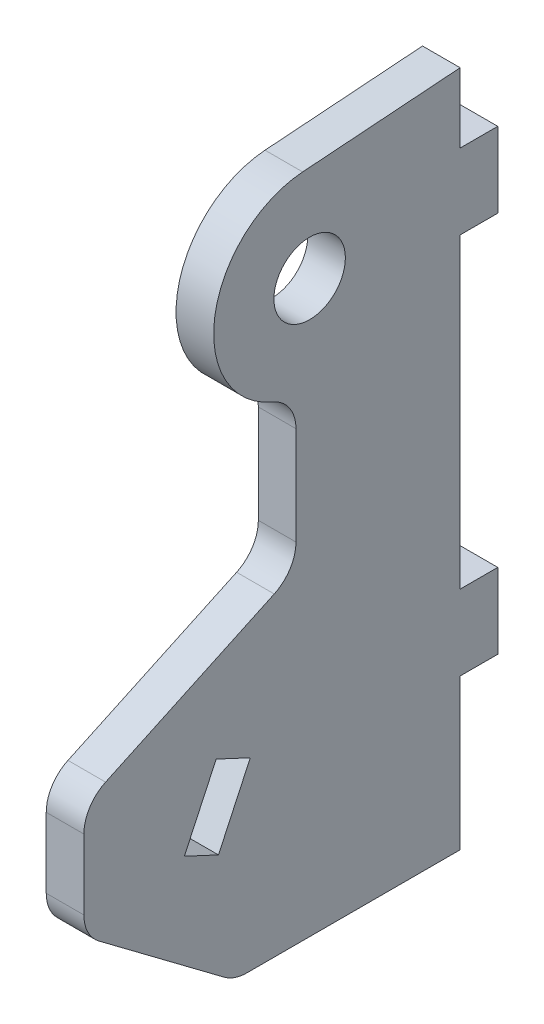
ISO-10303-21;
HEADER;
FILE_DESCRIPTION(('STEP AP214'),'2;1');
FILE_NAME('part.step','',(''),(''),'','','');
FILE_SCHEMA(('AUTOMOTIVE_DESIGN { 1 0 10303 214 1 1 1 1 }'));
ENDSEC;
DATA;
#1=APPLICATION_CONTEXT('core data for automotive mechanical design processes');
#2=APPLICATION_PROTOCOL_DEFINITION('international standard','automotive_design',2000,#1);
#3=PRODUCT_CONTEXT('',#1,'mechanical');
#4=PRODUCT('Part','Part','',(#3));
#5=PRODUCT_RELATED_PRODUCT_CATEGORY('part','',(#4));
#6=PRODUCT_DEFINITION_FORMATION('','',#4);
#7=PRODUCT_DEFINITION_CONTEXT('part definition',#1,'design');
#8=PRODUCT_DEFINITION('design','',#6,#7);
#9=PRODUCT_DEFINITION_SHAPE('','',#8);
#10=(LENGTH_UNIT() NAMED_UNIT(*) SI_UNIT(.MILLI.,.METRE.));
#11=(NAMED_UNIT(*) PLANE_ANGLE_UNIT() SI_UNIT($,.RADIAN.));
#12=(NAMED_UNIT(*) SI_UNIT($,.STERADIAN.) SOLID_ANGLE_UNIT());
#13=UNCERTAINTY_MEASURE_WITH_UNIT(LENGTH_MEASURE(1.E-05),#10,'distance_accuracy_value','');
#14=(GEOMETRIC_REPRESENTATION_CONTEXT(3) GLOBAL_UNCERTAINTY_ASSIGNED_CONTEXT((#13)) GLOBAL_UNIT_ASSIGNED_CONTEXT((#10,
#11,#12)) REPRESENTATION_CONTEXT('',''));
#15=CARTESIAN_POINT('',(0.,0.,0.));
#16=DIRECTION('',(0.,0.,1.));
#17=DIRECTION('',(1.,0.,0.));
#18=AXIS2_PLACEMENT_3D('',#15,#16,#17);
#19=CARTESIAN_POINT('',(2.5,-15.7577175116872,0.));
#20=DIRECTION('',(0.,0.,1.));
#21=DIRECTION('',(1.,0.,0.));
#22=AXIS2_PLACEMENT_3D('',#19,#20,#21);
#23=PLANE('',#22);
#24=DIRECTION('',(-1.,0.,0.));
#25=VECTOR('',#24,1.);
#26=CARTESIAN_POINT('',(0.,-55.7577175116872,0.));
#27=LINE('',#26,#25);
#28=CARTESIAN_POINT('',(2.5,-55.7577175116872,0.));
#29=VERTEX_POINT('',#28);
#30=CARTESIAN_POINT('',(-2.5,-55.7577175116872,0.));
#31=VERTEX_POINT('',#30);
#32=EDGE_CURVE('E64',#29,#31,#27,.T.);
#33=ORIENTED_EDGE('',*,*,#32,.F.);
#34=DIRECTION('',(0.,1.,0.));
#35=VECTOR('',#34,1.);
#36=CARTESIAN_POINT('',(2.5,-75.7577175116872,0.));
#37=LINE('',#36,#35);
#38=CARTESIAN_POINT('',(2.5,-75.7577175116872,0.));
#39=VERTEX_POINT('',#38);
#40=EDGE_CURVE('E306',#39,#29,#37,.T.);
#41=ORIENTED_EDGE('',*,*,#40,.F.);
#42=DIRECTION('',(-1.,0.,0.));
#43=VECTOR('',#42,1.);
#44=CARTESIAN_POINT('',(2.5,-75.7577175116872,0.));
#45=LINE('',#44,#43);
#46=CARTESIAN_POINT('',(-2.5,-75.7577175116872,0.));
#47=VERTEX_POINT('',#46);
#48=EDGE_CURVE('E355',#39,#47,#45,.T.);
#49=ORIENTED_EDGE('',*,*,#48,.T.);
#50=DIRECTION('',(0.,1.,0.));
#51=VECTOR('',#50,1.);
#52=CARTESIAN_POINT('',(-2.5,-15.7577175116872,0.));
#53=LINE('',#52,#51);
#54=EDGE_CURVE('E337',#47,#31,#53,.T.);
#55=ORIENTED_EDGE('',*,*,#54,.T.);
#56=EDGE_LOOP('',(#33,#41,#49,#55));
#57=FACE_BOUND('',#56,.T.);
#58=ADVANCED_FACE('F41',(#57),#23,.F.);
#59=CARTESIAN_POINT('',(2.5,0.,20.));
#60=DIRECTION('',(1.,0.,0.));
#61=DIRECTION('',(0.,0.,-1.));
#62=AXIS2_PLACEMENT_3D('',#59,#60,#61);
#63=PLANE('',#62);
#64=DIRECTION('',(0.,0.4226182617407,0.90630778703665));
#65=VECTOR('',#64,1.);
#66=CARTESIAN_POINT('',(2.5,-51.2261785765039,27.8869086912965));
#67=LINE('',#66,#65);
#68=CARTESIAN_POINT('',(2.5,-51.2261785765039,27.8869086912965));
#69=VERTEX_POINT('',#68);
#70=CARTESIAN_POINT('',(2.5,-49.1130872678004,32.4184476264797));
#71=VERTEX_POINT('',#70);
#72=EDGE_CURVE('E254',#69,#71,#67,.T.);
#73=ORIENTED_EDGE('',*,*,#72,.F.);
#74=DIRECTION('',(0.,-0.90630778703665,0.4226182617407));
#75=VECTOR('',#74,1.);
#76=CARTESIAN_POINT('',(2.5,-51.2261785765039,27.8869086912965));
#77=LINE('',#76,#75);
#78=CARTESIAN_POINT('',(2.5,-60.2892564468704,32.1130913087035));
#79=VERTEX_POINT('',#78);
#80=EDGE_CURVE('E262',#69,#79,#77,.T.);
#81=ORIENTED_EDGE('',*,*,#80,.T.);
#82=DIRECTION('',(0.,0.422618261740699,0.90630778703665));
#83=VECTOR('',#82,1.);
#84=CARTESIAN_POINT('',(2.5,-60.2892564468704,32.1130913087035));
#85=LINE('',#84,#83);
#86=CARTESIAN_POINT('',(2.5,-58.1761651381669,36.6446302438868));
#87=VERTEX_POINT('',#86);
#88=EDGE_CURVE('E259',#79,#87,#85,.T.);
#89=ORIENTED_EDGE('',*,*,#88,.T.);
#90=DIRECTION('',(0.,-0.90630778703665,0.422618261740701));
#91=VECTOR('',#90,1.);
#92=CARTESIAN_POINT('',(2.5,-49.1130872678004,32.4184476264797));
#93=LINE('',#92,#91);
#94=EDGE_CURVE('E256',#71,#87,#93,.T.);
#95=ORIENTED_EDGE('',*,*,#94,.F.);
#96=EDGE_LOOP('',(#73,#81,#89,#95));
#97=FACE_BOUND('',#96,.T.);
#98=DIRECTION('',(0.,-0.6,-0.8));
#99=VECTOR('',#98,1.);
#100=CARTESIAN_POINT('',(2.5,-75.7577175116872,30.));
#101=LINE('',#100,#99);
#102=CARTESIAN_POINT('',(2.5,-62.2577175116872,48.));
#103=VERTEX_POINT('',#102);
#104=CARTESIAN_POINT('',(2.5,-74.7577175116872,31.3333333333333));
#105=VERTEX_POINT('',#104);
#106=EDGE_CURVE('E302',#103,#105,#101,.T.);
#107=ORIENTED_EDGE('',*,*,#106,.T.);
#108=CARTESIAN_POINT('',(2.5,-70.7577175116872,28.3333333333333));
#109=DIRECTION('',(1.,0.,0.));
#110=DIRECTION('',(0.,0.,-1.));
#111=AXIS2_PLACEMENT_3D('',#108,#109,#110);
#112=CIRCLE('',#111,5.);
#113=CARTESIAN_POINT('',(2.5,-75.7577175116872,28.3333333333333));
#114=VERTEX_POINT('',#113);
#115=EDGE_CURVE('E394',#105,#114,#112,.T.);
#116=ORIENTED_EDGE('',*,*,#115,.T.);
#117=DIRECTION('',(0.,0.,-1.));
#118=VECTOR('',#117,1.);
#119=CARTESIAN_POINT('',(2.5,-75.7577175116872,30.));
#120=LINE('',#119,#118);
#121=EDGE_CURVE('E304',#114,#39,#120,.T.);
#122=ORIENTED_EDGE('',*,*,#121,.T.);
#123=ORIENTED_EDGE('',*,*,#40,.T.);
#124=DIRECTION('',(0.,0.,1.));
#125=VECTOR('',#124,1.);
#126=CARTESIAN_POINT('',(2.5,-55.7577175116872,-5.));
#127=LINE('',#126,#125);
#128=CARTESIAN_POINT('',(2.5,-55.7577175116872,-5.));
#129=VERTEX_POINT('',#128);
#130=EDGE_CURVE('E218',#129,#29,#127,.T.);
#131=ORIENTED_EDGE('',*,*,#130,.F.);
#132=DIRECTION('',(0.,-1.,0.));
#133=VECTOR('',#132,1.);
#134=CARTESIAN_POINT('',(2.5,0.,-5.));
#135=LINE('',#134,#133);
#136=CARTESIAN_POINT('',(2.5,-45.7577175116872,-5.));
#137=VERTEX_POINT('',#136);
#138=EDGE_CURVE('E221',#137,#129,#135,.T.);
#139=ORIENTED_EDGE('',*,*,#138,.F.);
#140=DIRECTION('',(0.,0.,1.));
#141=VECTOR('',#140,1.);
#142=CARTESIAN_POINT('',(2.5,-45.7577175116872,-5.));
#143=LINE('',#142,#141);
#144=CARTESIAN_POINT('',(2.5,-45.7577175116872,0.));
#145=VERTEX_POINT('',#144);
#146=EDGE_CURVE('E209',#137,#145,#143,.T.);
#147=ORIENTED_EDGE('',*,*,#146,.T.);
#148=CARTESIAN_POINT('',(2.5,-5.,0.));
#149=VERTEX_POINT('',#148);
#150=EDGE_CURVE('E56',#145,#149,#37,.T.);
#151=ORIENTED_EDGE('',*,*,#150,.T.);
#152=DIRECTION('',(0.,0.,-1.));
#153=VECTOR('',#152,1.);
#154=CARTESIAN_POINT('',(2.5,-5.,-5.));
#155=LINE('',#154,#153);
#156=CARTESIAN_POINT('',(2.5,-5.,-5.));
#157=VERTEX_POINT('',#156);
#158=EDGE_CURVE('E308',#149,#157,#155,.T.);
#159=ORIENTED_EDGE('',*,*,#158,.T.);
#160=DIRECTION('',(0.,1.,0.));
#161=VECTOR('',#160,1.);
#162=CARTESIAN_POINT('',(2.5,5.,-5.));
#163=LINE('',#162,#161);
#164=CARTESIAN_POINT('',(2.5,5.,-5.));
#165=VERTEX_POINT('',#164);
#166=EDGE_CURVE('E310',#157,#165,#163,.T.);
#167=ORIENTED_EDGE('',*,*,#166,.T.);
#168=DIRECTION('',(0.,0.,1.));
#169=VECTOR('',#168,1.);
#170=CARTESIAN_POINT('',(2.5,5.,-5.));
#171=LINE('',#170,#169);
#172=CARTESIAN_POINT('',(2.5,5.,0.));
#173=VERTEX_POINT('',#172);
#174=EDGE_CURVE('E312',#165,#173,#171,.T.);
#175=ORIENTED_EDGE('',*,*,#174,.T.);
#176=DIRECTION('',(0.,1.,0.));
#177=VECTOR('',#176,1.);
#178=CARTESIAN_POINT('',(2.5,5.,0.));
#179=LINE('',#178,#177);
#180=CARTESIAN_POINT('',(2.5,14.2422824883128,0.));
#181=VERTEX_POINT('',#180);
#182=EDGE_CURVE('E284',#173,#181,#179,.T.);
#183=ORIENTED_EDGE('',*,*,#182,.T.);
#184=DIRECTION('',(0.,-0.0727282972971378,0.997351790880359));
#185=VECTOR('',#184,1.);
#186=CARTESIAN_POINT('',(2.5,14.2422824883128,0.));
#187=LINE('',#186,#185);
#188=CARTESIAN_POINT('',(2.5,12.7162353337246,20.9272857905385));
#189=VERTEX_POINT('',#188);
#190=EDGE_CURVE('E287',#181,#189,#187,.T.);
#191=ORIENTED_EDGE('',*,*,#190,.T.);
#192=CARTESIAN_POINT('',(2.5,0.,20.));
#193=DIRECTION('',(1.,0.,0.));
#194=DIRECTION('',(0.,0.,-1.));
#195=AXIS2_PLACEMENT_3D('',#192,#193,#194);
#196=CIRCLE('',#195,12.75);
#197=CARTESIAN_POINT('',(2.5,-11.7727645964355,24.8953563462647));
#198=VERTEX_POINT('',#197);
#199=EDGE_CURVE('E290',#189,#198,#196,.T.);
#200=ORIENTED_EDGE('',*,*,#199,.T.);
#201=CARTESIAN_POINT('',(2.5,-16.3895350264103,26.8151039330352));
#202=DIRECTION('',(1.,0.,0.));
#203=DIRECTION('',(0.,0.,-1.));
#204=AXIS2_PLACEMENT_3D('',#201,#202,#203);
#205=CIRCLE('',#204,5.);
#206=CARTESIAN_POINT('',(2.5,-16.3895350264103,21.8151039330352));
#207=VERTEX_POINT('',#206);
#208=EDGE_CURVE('E403',#198,#207,#205,.F.);
#209=ORIENTED_EDGE('',*,*,#208,.T.);
#210=DIRECTION('',(0.,-1.,0.));
#211=VECTOR('',#210,1.);
#212=CARTESIAN_POINT('',(2.5,-32.6201385773802,21.8151039330352));
#213=LINE('',#212,#211);
#214=CARTESIAN_POINT('',(2.5,-29.4342490600651,21.8151039330352));
#215=VERTEX_POINT('',#214);
#216=EDGE_CURVE('E293',#207,#215,#213,.T.);
#217=ORIENTED_EDGE('',*,*,#216,.T.);
#218=CARTESIAN_POINT('',(2.5,-29.4342490600651,26.8151039330352));
#219=DIRECTION('',(1.,0.,0.));
#220=DIRECTION('',(0.,0.,-1.));
#221=AXIS2_PLACEMENT_3D('',#218,#219,#220);
#222=CIRCLE('',#221,5.);
#223=CARTESIAN_POINT('',(2.5,-33.9661115133212,24.7027065497836));
#224=VERTEX_POINT('',#223);
#225=EDGE_CURVE('E11',#215,#224,#222,.F.);
#226=ORIENTED_EDGE('',*,*,#225,.T.);
#227=DIRECTION('',(0.,-0.42247947665031,0.906372490651211));
#228=VECTOR('',#227,1.);
#229=CARTESIAN_POINT('',(2.5,-45.7577175116872,50.));
#230=LINE('',#229,#228);
#231=CARTESIAN_POINT('',(2.5,-44.4117445757462,47.1123973832516));
#232=VERTEX_POINT('',#231);
#233=EDGE_CURVE('E296',#224,#232,#230,.T.);
#234=ORIENTED_EDGE('',*,*,#233,.T.);
#235=CARTESIAN_POINT('',(2.5,-48.9436070290023,45.));
#236=DIRECTION('',(1.,0.,0.));
#237=DIRECTION('',(0.,0.,-1.));
#238=AXIS2_PLACEMENT_3D('',#235,#236,#237);
#239=CIRCLE('',#238,5.);
#240=CARTESIAN_POINT('',(2.5,-48.9436070290023,50.));
#241=VERTEX_POINT('',#240);
#242=EDGE_CURVE('E390',#232,#241,#239,.T.);
#243=ORIENTED_EDGE('',*,*,#242,.T.);
#244=DIRECTION('',(0.,-1.,0.));
#245=VECTOR('',#244,1.);
#246=CARTESIAN_POINT('',(2.5,-60.7577175116872,50.));
#247=LINE('',#246,#245);
#248=CARTESIAN_POINT('',(2.5,-58.2577175116872,50.));
#249=VERTEX_POINT('',#248);
#250=EDGE_CURVE('E299',#241,#249,#247,.T.);
#251=ORIENTED_EDGE('',*,*,#250,.T.);
#252=CARTESIAN_POINT('',(2.5,-58.2577175116872,45.));
#253=DIRECTION('',(1.,0.,0.));
#254=DIRECTION('',(0.,0.,-1.));
#255=AXIS2_PLACEMENT_3D('',#252,#253,#254);
#256=CIRCLE('',#255,5.);
#257=EDGE_CURVE('E392',#249,#103,#256,.T.);
#258=ORIENTED_EDGE('',*,*,#257,.T.);
#259=EDGE_LOOP('',(#107,#116,#122,#123,#131,#139,#147,#151,#159,#167,#175,#183,#191,#200,#209,
#217,#226,#234,#243,#251,#258));
#260=FACE_BOUND('',#259,.T.);
#261=CARTESIAN_POINT('',(2.5,0.,20.));
#262=DIRECTION('',(1.,0.,0.));
#263=DIRECTION('',(0.,0.,-1.));
#264=AXIS2_PLACEMENT_3D('',#261,#262,#263);
#265=CIRCLE('',#264,4.75);
#266=CARTESIAN_POINT('',(2.5,0.,15.25));
#267=VERTEX_POINT('',#266);
#268=EDGE_CURVE('E278',#267,#267,#265,.T.);
#269=ORIENTED_EDGE('',*,*,#268,.F.);
#270=EDGE_LOOP('',(#269));
#271=FACE_BOUND('',#270,.T.);
#272=ADVANCED_FACE('F223',(#97,#260,#271),#63,.T.);
#273=CARTESIAN_POINT('',(-2.5,0.,20.));
#274=DIRECTION('',(1.,0.,0.));
#275=DIRECTION('',(0.,0.,-1.));
#276=AXIS2_PLACEMENT_3D('',#273,#274,#275);
#277=PLANE('',#276);
#278=DIRECTION('',(0.,0.90630778703665,-0.4226182617407));
#279=VECTOR('',#278,1.);
#280=CARTESIAN_POINT('',(-2.5,-51.2261785765039,27.8869086912965));
#281=LINE('',#280,#279);
#282=CARTESIAN_POINT('',(-2.5,-60.2892564468704,32.1130913087035));
#283=VERTEX_POINT('',#282);
#284=CARTESIAN_POINT('',(-2.5,-51.2261785765039,27.8869086912965));
#285=VERTEX_POINT('',#284);
#286=EDGE_CURVE('E248',#283,#285,#281,.T.);
#287=ORIENTED_EDGE('',*,*,#286,.T.);
#288=DIRECTION('',(0.,-0.4226182617407,-0.90630778703665));
#289=VECTOR('',#288,1.);
#290=CARTESIAN_POINT('',(-2.5,-51.2261785765039,27.8869086912965));
#291=LINE('',#290,#289);
#292=CARTESIAN_POINT('',(-2.5,-49.1130872678004,32.4184476264797));
#293=VERTEX_POINT('',#292);
#294=EDGE_CURVE('E251',#293,#285,#291,.T.);
#295=ORIENTED_EDGE('',*,*,#294,.F.);
#296=DIRECTION('',(0.,0.90630778703665,-0.422618261740701));
#297=VECTOR('',#296,1.);
#298=CARTESIAN_POINT('',(-2.5,-49.1130872678004,32.4184476264797));
#299=LINE('',#298,#297);
#300=CARTESIAN_POINT('',(-2.5,-58.1761651381669,36.6446302438868));
#301=VERTEX_POINT('',#300);
#302=EDGE_CURVE('E268',#301,#293,#299,.T.);
#303=ORIENTED_EDGE('',*,*,#302,.F.);
#304=DIRECTION('',(0.,-0.422618261740699,-0.90630778703665));
#305=VECTOR('',#304,1.);
#306=CARTESIAN_POINT('',(-2.5,-60.2892564468704,32.1130913087035));
#307=LINE('',#306,#305);
#308=EDGE_CURVE('E217',#301,#283,#307,.T.);
#309=ORIENTED_EDGE('',*,*,#308,.T.);
#310=EDGE_LOOP('',(#287,#295,#303,#309));
#311=FACE_BOUND('',#310,.T.);
#312=DIRECTION('',(0.,0.,-1.));
#313=VECTOR('',#312,1.);
#314=CARTESIAN_POINT('',(-2.5,-75.7577175116872,30.));
#315=LINE('',#314,#313);
#316=CARTESIAN_POINT('',(-2.5,-75.7577175116872,28.3333333333333));
#317=VERTEX_POINT('',#316);
#318=EDGE_CURVE('E334',#317,#47,#315,.T.);
#319=ORIENTED_EDGE('',*,*,#318,.F.);
#320=CARTESIAN_POINT('',(-2.5,-70.7577175116872,28.3333333333333));
#321=DIRECTION('',(1.,0.,0.));
#322=DIRECTION('',(0.,0.,-1.));
#323=AXIS2_PLACEMENT_3D('',#320,#321,#322);
#324=CIRCLE('',#323,5.);
#325=CARTESIAN_POINT('',(-2.5,-74.7577175116872,31.3333333333333));
#326=VERTEX_POINT('',#325);
#327=EDGE_CURVE('E383',#317,#326,#324,.F.);
#328=ORIENTED_EDGE('',*,*,#327,.T.);
#329=DIRECTION('',(0.,-0.6,-0.8));
#330=VECTOR('',#329,1.);
#331=CARTESIAN_POINT('',(-2.5,-75.7577175116872,30.));
#332=LINE('',#331,#330);
#333=CARTESIAN_POINT('',(-2.5,-62.2577175116872,48.));
#334=VERTEX_POINT('',#333);
#335=EDGE_CURVE('E331',#334,#326,#332,.T.);
#336=ORIENTED_EDGE('',*,*,#335,.F.);
#337=CARTESIAN_POINT('',(-2.5,-58.2577175116872,45.));
#338=DIRECTION('',(1.,0.,0.));
#339=DIRECTION('',(0.,0.,-1.));
#340=AXIS2_PLACEMENT_3D('',#337,#338,#339);
#341=CIRCLE('',#340,5.);
#342=CARTESIAN_POINT('',(-2.5,-58.2577175116872,50.));
#343=VERTEX_POINT('',#342);
#344=EDGE_CURVE('E381',#334,#343,#341,.F.);
#345=ORIENTED_EDGE('',*,*,#344,.T.);
#346=DIRECTION('',(0.,-1.,0.));
#347=VECTOR('',#346,1.);
#348=CARTESIAN_POINT('',(-2.5,-60.7577175116872,50.));
#349=LINE('',#348,#347);
#350=CARTESIAN_POINT('',(-2.5,-48.9436070290023,50.));
#351=VERTEX_POINT('',#350);
#352=EDGE_CURVE('E328',#351,#343,#349,.T.);
#353=ORIENTED_EDGE('',*,*,#352,.F.);
#354=CARTESIAN_POINT('',(-2.5,-48.9436070290023,45.));
#355=DIRECTION('',(1.,0.,0.));
#356=DIRECTION('',(0.,0.,-1.));
#357=AXIS2_PLACEMENT_3D('',#354,#355,#356);
#358=CIRCLE('',#357,5.);
#359=CARTESIAN_POINT('',(-2.5,-44.4117445757462,47.1123973832516));
#360=VERTEX_POINT('',#359);
#361=EDGE_CURVE('E379',#351,#360,#358,.F.);
#362=ORIENTED_EDGE('',*,*,#361,.T.);
#363=DIRECTION('',(0.,-0.42247947665031,0.906372490651211));
#364=VECTOR('',#363,1.);
#365=CARTESIAN_POINT('',(-2.5,-45.7577175116872,50.));
#366=LINE('',#365,#364);
#367=CARTESIAN_POINT('',(-2.5,-33.9661115133212,24.7027065497836));
#368=VERTEX_POINT('',#367);
#369=EDGE_CURVE('E325',#368,#360,#366,.T.);
#370=ORIENTED_EDGE('',*,*,#369,.F.);
#371=CARTESIAN_POINT('',(-2.5,-29.4342490600651,26.8151039330352));
#372=DIRECTION('',(1.,0.,0.));
#373=DIRECTION('',(0.,0.,-1.));
#374=AXIS2_PLACEMENT_3D('',#371,#372,#373);
#375=CIRCLE('',#374,5.);
#376=CARTESIAN_POINT('',(-2.5,-29.4342490600651,21.8151039330352));
#377=VERTEX_POINT('',#376);
#378=EDGE_CURVE('E49',#368,#377,#375,.T.);
#379=ORIENTED_EDGE('',*,*,#378,.T.);
#380=DIRECTION('',(0.,-1.,0.));
#381=VECTOR('',#380,1.);
#382=CARTESIAN_POINT('',(-2.5,-32.6201385773802,21.8151039330352));
#383=LINE('',#382,#381);
#384=CARTESIAN_POINT('',(-2.5,-16.3895350264103,21.8151039330352));
#385=VERTEX_POINT('',#384);
#386=EDGE_CURVE('E322',#385,#377,#383,.T.);
#387=ORIENTED_EDGE('',*,*,#386,.F.);
#388=CARTESIAN_POINT('',(-2.5,-16.3895350264103,26.8151039330352));
#389=DIRECTION('',(1.,0.,0.));
#390=DIRECTION('',(0.,0.,-1.));
#391=AXIS2_PLACEMENT_3D('',#388,#389,#390);
#392=CIRCLE('',#391,5.);
#393=CARTESIAN_POINT('',(-2.5,-11.7727645964355,24.8953563462647));
#394=VERTEX_POINT('',#393);
#395=EDGE_CURVE('E401',#385,#394,#392,.T.);
#396=ORIENTED_EDGE('',*,*,#395,.T.);
#397=CARTESIAN_POINT('',(-2.5,0.,20.));
#398=DIRECTION('',(1.,0.,0.));
#399=DIRECTION('',(0.,0.,-1.));
#400=AXIS2_PLACEMENT_3D('',#397,#398,#399);
#401=CIRCLE('',#400,12.75);
#402=CARTESIAN_POINT('',(-2.5,12.7162353337246,20.9272857905385));
#403=VERTEX_POINT('',#402);
#404=EDGE_CURVE('E319',#403,#394,#401,.T.);
#405=ORIENTED_EDGE('',*,*,#404,.F.);
#406=DIRECTION('',(0.,-0.0727282972971378,0.997351790880359));
#407=VECTOR('',#406,1.);
#408=CARTESIAN_POINT('',(-2.5,14.2422824883128,0.));
#409=LINE('',#408,#407);
#410=CARTESIAN_POINT('',(-2.5,14.2422824883128,0.));
#411=VERTEX_POINT('',#410);
#412=EDGE_CURVE('E317',#411,#403,#409,.T.);
#413=ORIENTED_EDGE('',*,*,#412,.F.);
#414=DIRECTION('',(0.,1.,0.));
#415=VECTOR('',#414,1.);
#416=CARTESIAN_POINT('',(-2.5,5.,0.));
#417=LINE('',#416,#415);
#418=CARTESIAN_POINT('',(-2.5,5.,0.));
#419=VERTEX_POINT('',#418);
#420=EDGE_CURVE('E281',#419,#411,#417,.T.);
#421=ORIENTED_EDGE('',*,*,#420,.F.);
#422=DIRECTION('',(0.,0.,1.));
#423=VECTOR('',#422,1.);
#424=CARTESIAN_POINT('',(-2.5,5.,-5.));
#425=LINE('',#424,#423);
#426=CARTESIAN_POINT('',(-2.5,5.,-5.));
#427=VERTEX_POINT('',#426);
#428=EDGE_CURVE('E288',#427,#419,#425,.T.);
#429=ORIENTED_EDGE('',*,*,#428,.F.);
#430=DIRECTION('',(0.,1.,0.));
#431=VECTOR('',#430,1.);
#432=CARTESIAN_POINT('',(-2.5,5.,-5.));
#433=LINE('',#432,#431);
#434=CARTESIAN_POINT('',(-2.5,-5.,-5.));
#435=VERTEX_POINT('',#434);
#436=EDGE_CURVE('E341',#435,#427,#433,.T.);
#437=ORIENTED_EDGE('',*,*,#436,.F.);
#438=DIRECTION('',(0.,0.,-1.));
#439=VECTOR('',#438,1.);
#440=CARTESIAN_POINT('',(-2.5,-5.,-5.));
#441=LINE('',#440,#439);
#442=CARTESIAN_POINT('',(-2.5,-5.,0.));
#443=VERTEX_POINT('',#442);
#444=EDGE_CURVE('E339',#443,#435,#441,.T.);
#445=ORIENTED_EDGE('',*,*,#444,.F.);
#446=CARTESIAN_POINT('',(-2.5,-45.7577175116872,0.));
#447=VERTEX_POINT('',#446);
#448=EDGE_CURVE('E336',#447,#443,#53,.T.);
#449=ORIENTED_EDGE('',*,*,#448,.F.);
#450=DIRECTION('',(0.,0.,1.));
#451=VECTOR('',#450,1.);
#452=CARTESIAN_POINT('',(-2.5,-45.7577175116872,-5.));
#453=LINE('',#452,#451);
#454=CARTESIAN_POINT('',(-2.5,-45.7577175116872,-5.));
#455=VERTEX_POINT('',#454);
#456=EDGE_CURVE('E239',#455,#447,#453,.T.);
#457=ORIENTED_EDGE('',*,*,#456,.F.);
#458=DIRECTION('',(0.,1.,0.));
#459=VECTOR('',#458,1.);
#460=CARTESIAN_POINT('',(-2.5,0.,-5.));
#461=LINE('',#460,#459);
#462=CARTESIAN_POINT('',(-2.5,-55.7577175116872,-5.));
#463=VERTEX_POINT('',#462);
#464=EDGE_CURVE('E232',#463,#455,#461,.T.);
#465=ORIENTED_EDGE('',*,*,#464,.F.);
#466=DIRECTION('',(0.,0.,1.));
#467=VECTOR('',#466,1.);
#468=CARTESIAN_POINT('',(-2.5,-55.7577175116872,-5.));
#469=LINE('',#468,#467);
#470=EDGE_CURVE('E242',#463,#31,#469,.T.);
#471=ORIENTED_EDGE('',*,*,#470,.T.);
#472=ORIENTED_EDGE('',*,*,#54,.F.);
#473=EDGE_LOOP('',(#319,#328,#336,#345,#353,#362,#370,#379,#387,#396,#405,#413,#421,#429,#437,
#445,#449,#457,#465,#471,#472));
#474=FACE_BOUND('',#473,.T.);
#475=CARTESIAN_POINT('',(-2.5,0.,20.));
#476=DIRECTION('',(1.,0.,0.));
#477=DIRECTION('',(0.,0.,-1.));
#478=AXIS2_PLACEMENT_3D('',#475,#476,#477);
#479=CIRCLE('',#478,4.75);
#480=CARTESIAN_POINT('',(-2.5,0.,15.25));
#481=VERTEX_POINT('',#480);
#482=EDGE_CURVE('E277',#481,#481,#479,.T.);
#483=ORIENTED_EDGE('',*,*,#482,.T.);
#484=EDGE_LOOP('',(#483));
#485=FACE_BOUND('',#484,.T.);
#486=ADVANCED_FACE('F408',(#311,#474,#485),#277,.F.);
#487=CARTESIAN_POINT('',(2.5,5.,0.));
#488=DIRECTION('',(0.,0.,1.));
#489=DIRECTION('',(1.,0.,0.));
#490=AXIS2_PLACEMENT_3D('',#487,#488,#489);
#491=PLANE('',#490);
#492=ORIENTED_EDGE('',*,*,#420,.T.);
#493=DIRECTION('',(-1.,0.,0.));
#494=VECTOR('',#493,1.);
#495=CARTESIAN_POINT('',(2.5,14.2422824883128,0.));
#496=LINE('',#495,#494);
#497=EDGE_CURVE('E361',#181,#411,#496,.T.);
#498=ORIENTED_EDGE('',*,*,#497,.F.);
#499=ORIENTED_EDGE('',*,*,#182,.F.);
#500=DIRECTION('',(-1.,0.,0.));
#501=VECTOR('',#500,1.);
#502=CARTESIAN_POINT('',(2.5,5.,0.));
#503=LINE('',#502,#501);
#504=EDGE_CURVE('E314',#173,#419,#503,.T.);
#505=ORIENTED_EDGE('',*,*,#504,.T.);
#506=EDGE_LOOP('',(#492,#498,#499,#505));
#507=FACE_BOUND('',#506,.T.);
#508=ADVANCED_FACE('F477',(#507),#491,.F.);
#509=CARTESIAN_POINT('',(2.5,14.2422824883128,0.));
#510=DIRECTION('',(0.,-0.997351790880359,-0.0727282972971378));
#511=DIRECTION('',(0.,0.0727282972971378,-0.997351790880359));
#512=AXIS2_PLACEMENT_3D('',#509,#510,#511);
#513=PLANE('',#512);
#514=ORIENTED_EDGE('',*,*,#412,.T.);
#515=DIRECTION('',(-1.,0.,0.));
#516=VECTOR('',#515,1.);
#517=CARTESIAN_POINT('',(2.5,12.7162353337246,20.9272857905385));
#518=LINE('',#517,#516);
#519=EDGE_CURVE('E358',#189,#403,#518,.T.);
#520=ORIENTED_EDGE('',*,*,#519,.F.);
#521=ORIENTED_EDGE('',*,*,#190,.F.);
#522=ORIENTED_EDGE('',*,*,#497,.T.);
#523=EDGE_LOOP('',(#514,#520,#521,#522));
#524=FACE_BOUND('',#523,.T.);
#525=ADVANCED_FACE('F509',(#524),#513,.F.);
#526=CARTESIAN_POINT('',(2.5,0.,20.));
#527=DIRECTION('',(-1.,0.,0.));
#528=DIRECTION('',(0.,0.,1.));
#529=AXIS2_PLACEMENT_3D('',#526,#527,#528);
#530=CYLINDRICAL_SURFACE('',#529,12.75);
#531=ORIENTED_EDGE('',*,*,#404,.T.);
#532=DIRECTION('',(-1.,0.,0.));
#533=VECTOR('',#532,1.);
#534=CARTESIAN_POINT('',(2.5,-11.7727645964355,24.8953563462647));
#535=LINE('',#534,#533);
#536=EDGE_CURVE('E369',#394,#198,#535,.F.);
#537=ORIENTED_EDGE('',*,*,#536,.T.);
#538=ORIENTED_EDGE('',*,*,#199,.F.);
#539=ORIENTED_EDGE('',*,*,#519,.T.);
#540=EDGE_LOOP('',(#531,#537,#538,#539));
#541=FACE_BOUND('',#540,.T.);
#542=ADVANCED_FACE('F511',(#541),#530,.T.);
#543=CARTESIAN_POINT('',(2.5,-32.6201385773802,21.8151039330352));
#544=DIRECTION('',(0.,0.,-1.));
#545=DIRECTION('',(-1.,0.,0.));
#546=AXIS2_PLACEMENT_3D('',#543,#544,#545);
#547=PLANE('',#546);
#548=ORIENTED_EDGE('',*,*,#216,.F.);
#549=DIRECTION('',(1.,0.,0.));
#550=VECTOR('',#549,1.);
#551=CARTESIAN_POINT('',(-2.5,-16.3895350264103,21.8151039330352));
#552=LINE('',#551,#550);
#553=EDGE_CURVE('E366',#207,#385,#552,.F.);
#554=ORIENTED_EDGE('',*,*,#553,.T.);
#555=ORIENTED_EDGE('',*,*,#386,.T.);
#556=DIRECTION('',(-1.,0.,0.));
#557=VECTOR('',#556,1.);
#558=CARTESIAN_POINT('',(2.5,-29.4342490600651,21.8151039330352));
#559=LINE('',#558,#557);
#560=EDGE_CURVE('E364',#377,#215,#559,.F.);
#561=ORIENTED_EDGE('',*,*,#560,.T.);
#562=EDGE_LOOP('',(#548,#554,#555,#561));
#563=FACE_BOUND('',#562,.T.);
#564=ADVANCED_FACE('F415',(#563),#547,.F.);
#565=CARTESIAN_POINT('',(2.5,-45.7577175116872,50.));
#566=DIRECTION('',(0.,-0.906372490651211,-0.42247947665031));
#567=DIRECTION('',(0.,0.42247947665031,-0.906372490651211));
#568=AXIS2_PLACEMENT_3D('',#565,#566,#567);
#569=PLANE('',#568);
#570=ORIENTED_EDGE('',*,*,#233,.F.);
#571=DIRECTION('',(-1.,0.,0.));
#572=VECTOR('',#571,1.);
#573=CARTESIAN_POINT('',(-2.5,-33.9661115133212,24.7027065497836));
#574=LINE('',#573,#572);
#575=EDGE_CURVE('E373',#224,#368,#574,.T.);
#576=ORIENTED_EDGE('',*,*,#575,.T.);
#577=ORIENTED_EDGE('',*,*,#369,.T.);
#578=DIRECTION('',(-1.,0.,0.));
#579=VECTOR('',#578,1.);
#580=CARTESIAN_POINT('',(2.5,-44.4117445757462,47.1123973832516));
#581=LINE('',#580,#579);
#582=EDGE_CURVE('E371',#360,#232,#581,.F.);
#583=ORIENTED_EDGE('',*,*,#582,.T.);
#584=EDGE_LOOP('',(#570,#576,#577,#583));
#585=FACE_BOUND('',#584,.T.);
#586=ADVANCED_FACE('F422',(#585),#569,.F.);
#587=CARTESIAN_POINT('',(2.5,-60.7577175116872,50.));
#588=DIRECTION('',(0.,0.,-1.));
#589=DIRECTION('',(-1.,0.,0.));
#590=AXIS2_PLACEMENT_3D('',#587,#588,#589);
#591=PLANE('',#590);
#592=ORIENTED_EDGE('',*,*,#352,.T.);
#593=DIRECTION('',(-1.,0.,0.));
#594=VECTOR('',#593,1.);
#595=CARTESIAN_POINT('',(2.5,-58.2577175116872,50.));
#596=LINE('',#595,#594);
#597=EDGE_CURVE('E399',#343,#249,#596,.F.);
#598=ORIENTED_EDGE('',*,*,#597,.T.);
#599=ORIENTED_EDGE('',*,*,#250,.F.);
#600=DIRECTION('',(-1.,0.,0.));
#601=VECTOR('',#600,1.);
#602=CARTESIAN_POINT('',(2.5,-48.9436070290023,50.));
#603=LINE('',#602,#601);
#604=EDGE_CURVE('E396',#241,#351,#603,.T.);
#605=ORIENTED_EDGE('',*,*,#604,.T.);
#606=EDGE_LOOP('',(#592,#598,#599,#605));
#607=FACE_BOUND('',#606,.T.);
#608=ADVANCED_FACE('F429',(#607),#591,.F.);
#609=CARTESIAN_POINT('',(2.5,-75.7577175116872,30.));
#610=DIRECTION('',(0.,0.8,-0.6));
#611=DIRECTION('',(0.,0.6,0.8));
#612=AXIS2_PLACEMENT_3D('',#609,#610,#611);
#613=PLANE('',#612);
#614=ORIENTED_EDGE('',*,*,#335,.T.);
#615=DIRECTION('',(-1.,0.,0.));
#616=VECTOR('',#615,1.);
#617=CARTESIAN_POINT('',(2.5,-74.7577175116872,31.3333333333333));
#618=LINE('',#617,#616);
#619=EDGE_CURVE('E388',#326,#105,#618,.F.);
#620=ORIENTED_EDGE('',*,*,#619,.T.);
#621=ORIENTED_EDGE('',*,*,#106,.F.);
#622=DIRECTION('',(-1.,0.,0.));
#623=VECTOR('',#622,1.);
#624=CARTESIAN_POINT('',(2.5,-62.2577175116872,48.));
#625=LINE('',#624,#623);
#626=EDGE_CURVE('E385',#103,#334,#625,.T.);
#627=ORIENTED_EDGE('',*,*,#626,.T.);
#628=EDGE_LOOP('',(#614,#620,#621,#627));
#629=FACE_BOUND('',#628,.T.);
#630=ADVANCED_FACE('F438',(#629),#613,.F.);
#631=CARTESIAN_POINT('',(2.5,-75.7577175116872,30.));
#632=DIRECTION('',(0.,1.,0.));
#633=DIRECTION('',(0.,0.,1.));
#634=AXIS2_PLACEMENT_3D('',#631,#632,#633);
#635=PLANE('',#634);
#636=ORIENTED_EDGE('',*,*,#121,.F.);
#637=DIRECTION('',(-1.,0.,0.));
#638=VECTOR('',#637,1.);
#639=CARTESIAN_POINT('',(2.5,-75.7577175116872,28.3333333333333));
#640=LINE('',#639,#638);
#641=EDGE_CURVE('E376',#114,#317,#640,.T.);
#642=ORIENTED_EDGE('',*,*,#641,.T.);
#643=ORIENTED_EDGE('',*,*,#318,.T.);
#644=ORIENTED_EDGE('',*,*,#48,.F.);
#645=EDGE_LOOP('',(#636,#642,#643,#644));
#646=FACE_BOUND('',#645,.T.);
#647=ADVANCED_FACE('F447',(#646),#635,.F.);
#648=ORIENTED_EDGE('',*,*,#150,.F.);
#649=DIRECTION('',(-1.,0.,0.));
#650=VECTOR('',#649,1.);
#651=CARTESIAN_POINT('',(0.,-45.7577175116872,0.));
#652=LINE('',#651,#650);
#653=EDGE_CURVE('E215',#145,#447,#652,.T.);
#654=ORIENTED_EDGE('',*,*,#653,.T.);
#655=ORIENTED_EDGE('',*,*,#448,.T.);
#656=DIRECTION('',(-1.,0.,0.));
#657=VECTOR('',#656,1.);
#658=CARTESIAN_POINT('',(2.5,-5.,0.));
#659=LINE('',#658,#657);
#660=EDGE_CURVE('E352',#149,#443,#659,.T.);
#661=ORIENTED_EDGE('',*,*,#660,.F.);
#662=EDGE_LOOP('',(#648,#654,#655,#661));
#663=FACE_BOUND('',#662,.T.);
#664=ADVANCED_FACE('F454',(#663),#23,.F.);
#665=CARTESIAN_POINT('',(2.5,-5.,-5.));
#666=DIRECTION('',(0.,1.,0.));
#667=DIRECTION('',(0.,0.,1.));
#668=AXIS2_PLACEMENT_3D('',#665,#666,#667);
#669=PLANE('',#668);
#670=ORIENTED_EDGE('',*,*,#444,.T.);
#671=DIRECTION('',(-1.,0.,0.));
#672=VECTOR('',#671,1.);
#673=CARTESIAN_POINT('',(2.5,-5.,-5.));
#674=LINE('',#673,#672);
#675=EDGE_CURVE('E349',#157,#435,#674,.T.);
#676=ORIENTED_EDGE('',*,*,#675,.F.);
#677=ORIENTED_EDGE('',*,*,#158,.F.);
#678=ORIENTED_EDGE('',*,*,#660,.T.);
#679=EDGE_LOOP('',(#670,#676,#677,#678));
#680=FACE_BOUND('',#679,.T.);
#681=ADVANCED_FACE('F456',(#680),#669,.F.);
#682=CARTESIAN_POINT('',(2.5,5.,-5.));
#683=DIRECTION('',(0.,0.,1.));
#684=DIRECTION('',(0.,-1.,0.));
#685=AXIS2_PLACEMENT_3D('',#682,#683,#684);
#686=PLANE('',#685);
#687=ORIENTED_EDGE('',*,*,#436,.T.);
#688=DIRECTION('',(-1.,0.,0.));
#689=VECTOR('',#688,1.);
#690=CARTESIAN_POINT('',(2.5,5.,-5.));
#691=LINE('',#690,#689);
#692=EDGE_CURVE('E346',#165,#427,#691,.T.);
#693=ORIENTED_EDGE('',*,*,#692,.F.);
#694=ORIENTED_EDGE('',*,*,#166,.F.);
#695=ORIENTED_EDGE('',*,*,#675,.T.);
#696=EDGE_LOOP('',(#687,#693,#694,#695));
#697=FACE_BOUND('',#696,.T.);
#698=ADVANCED_FACE('F463',(#697),#686,.F.);
#699=CARTESIAN_POINT('',(2.5,5.,-5.));
#700=DIRECTION('',(0.,-1.,0.));
#701=DIRECTION('',(0.,0.,-1.));
#702=AXIS2_PLACEMENT_3D('',#699,#700,#701);
#703=PLANE('',#702);
#704=ORIENTED_EDGE('',*,*,#428,.T.);
#705=ORIENTED_EDGE('',*,*,#504,.F.);
#706=ORIENTED_EDGE('',*,*,#174,.F.);
#707=ORIENTED_EDGE('',*,*,#692,.T.);
#708=EDGE_LOOP('',(#704,#705,#706,#707));
#709=FACE_BOUND('',#708,.T.);
#710=ADVANCED_FACE('F485',(#709),#703,.F.);
#711=CARTESIAN_POINT('',(2.5,0.,20.));
#712=DIRECTION('',(-1.,0.,0.));
#713=DIRECTION('',(0.,0.,1.));
#714=AXIS2_PLACEMENT_3D('',#711,#712,#713);
#715=CYLINDRICAL_SURFACE('',#714,4.75);
#716=ORIENTED_EDGE('',*,*,#268,.T.);
#717=EDGE_LOOP('',(#716));
#718=FACE_BOUND('',#717,.T.);
#719=ORIENTED_EDGE('',*,*,#482,.F.);
#720=EDGE_LOOP('',(#719));
#721=FACE_BOUND('',#720,.T.);
#722=ADVANCED_FACE('F482',(#718,#721),#715,.F.);
#723=CARTESIAN_POINT('',(2.5,-16.3895350264103,26.8151039330352));
#724=DIRECTION('',(-1.,0.,0.));
#725=DIRECTION('',(0.,0.,1.));
#726=AXIS2_PLACEMENT_3D('',#723,#724,#725);
#727=CYLINDRICAL_SURFACE('',#726,5.);
#728=ORIENTED_EDGE('',*,*,#208,.F.);
#729=ORIENTED_EDGE('',*,*,#536,.F.);
#730=ORIENTED_EDGE('',*,*,#395,.F.);
#731=ORIENTED_EDGE('',*,*,#553,.F.);
#732=EDGE_LOOP('',(#728,#729,#730,#731));
#733=FACE_BOUND('',#732,.T.);
#734=ADVANCED_FACE('F514',(#733),#727,.F.);
#735=CARTESIAN_POINT('',(2.5,-29.4342490600651,26.8151039330352));
#736=DIRECTION('',(1.,0.,0.));
#737=DIRECTION('',(0.,0.,-1.));
#738=AXIS2_PLACEMENT_3D('',#735,#736,#737);
#739=CYLINDRICAL_SURFACE('',#738,5.);
#740=ORIENTED_EDGE('',*,*,#225,.F.);
#741=ORIENTED_EDGE('',*,*,#560,.F.);
#742=ORIENTED_EDGE('',*,*,#378,.F.);
#743=ORIENTED_EDGE('',*,*,#575,.F.);
#744=EDGE_LOOP('',(#740,#741,#742,#743));
#745=FACE_BOUND('',#744,.T.);
#746=ADVANCED_FACE('F418',(#745),#739,.F.);
#747=CARTESIAN_POINT('',(2.5,-70.7577175116872,28.3333333333333));
#748=DIRECTION('',(-1.,0.,0.));
#749=DIRECTION('',(0.,0.,1.));
#750=AXIS2_PLACEMENT_3D('',#747,#748,#749);
#751=CYLINDRICAL_SURFACE('',#750,5.);
#752=ORIENTED_EDGE('',*,*,#115,.F.);
#753=ORIENTED_EDGE('',*,*,#619,.F.);
#754=ORIENTED_EDGE('',*,*,#327,.F.);
#755=ORIENTED_EDGE('',*,*,#641,.F.);
#756=EDGE_LOOP('',(#752,#753,#754,#755));
#757=FACE_BOUND('',#756,.T.);
#758=ADVANCED_FACE('F442',(#757),#751,.T.);
#759=CARTESIAN_POINT('',(2.5,-58.2577175116872,45.));
#760=DIRECTION('',(-1.,0.,0.));
#761=DIRECTION('',(0.,0.,1.));
#762=AXIS2_PLACEMENT_3D('',#759,#760,#761);
#763=CYLINDRICAL_SURFACE('',#762,5.);
#764=ORIENTED_EDGE('',*,*,#257,.F.);
#765=ORIENTED_EDGE('',*,*,#597,.F.);
#766=ORIENTED_EDGE('',*,*,#344,.F.);
#767=ORIENTED_EDGE('',*,*,#626,.F.);
#768=EDGE_LOOP('',(#764,#765,#766,#767));
#769=FACE_BOUND('',#768,.T.);
#770=ADVANCED_FACE('F433',(#769),#763,.T.);
#771=CARTESIAN_POINT('',(2.5,-48.9436070290023,45.));
#772=DIRECTION('',(-1.,0.,0.));
#773=DIRECTION('',(0.,0.,1.));
#774=AXIS2_PLACEMENT_3D('',#771,#772,#773);
#775=CYLINDRICAL_SURFACE('',#774,5.);
#776=ORIENTED_EDGE('',*,*,#242,.F.);
#777=ORIENTED_EDGE('',*,*,#582,.F.);
#778=ORIENTED_EDGE('',*,*,#361,.F.);
#779=ORIENTED_EDGE('',*,*,#604,.F.);
#780=EDGE_LOOP('',(#776,#777,#778,#779));
#781=FACE_BOUND('',#780,.T.);
#782=ADVANCED_FACE('F43',(#781),#775,.T.);
#783=CARTESIAN_POINT('',(-2.501,-51.2261785765039,27.8869086912965));
#784=DIRECTION('',(0.,0.90630778703665,-0.4226182617407));
#785=DIRECTION('',(0.,0.4226182617407,0.90630778703665));
#786=AXIS2_PLACEMENT_3D('',#783,#784,#785);
#787=PLANE('',#786);
#788=ORIENTED_EDGE('',*,*,#294,.T.);
#789=DIRECTION('',(1.,0.,0.));
#790=VECTOR('',#789,1.);
#791=CARTESIAN_POINT('',(-2.501,-51.2261785765039,27.8869086912965));
#792=LINE('',#791,#790);
#793=EDGE_CURVE('E266',#285,#69,#792,.T.);
#794=ORIENTED_EDGE('',*,*,#793,.T.);
#795=ORIENTED_EDGE('',*,*,#72,.T.);
#796=DIRECTION('',(1.,0.,0.));
#797=VECTOR('',#796,1.);
#798=CARTESIAN_POINT('',(-2.501,-49.1130872678004,32.4184476264797));
#799=LINE('',#798,#797);
#800=EDGE_CURVE('E265',#293,#71,#799,.T.);
#801=ORIENTED_EDGE('',*,*,#800,.F.);
#802=EDGE_LOOP('',(#788,#794,#795,#801));
#803=FACE_BOUND('',#802,.T.);
#804=ADVANCED_FACE('F531',(#803),#787,.F.);
#805=CARTESIAN_POINT('',(-2.501,-51.2261785765039,27.8869086912965));
#806=DIRECTION('',(0.,0.4226182617407,0.90630778703665));
#807=DIRECTION('',(0.,-0.90630778703665,0.4226182617407));
#808=AXIS2_PLACEMENT_3D('',#805,#806,#807);
#809=PLANE('',#808);
#810=DIRECTION('',(1.,0.,0.));
#811=VECTOR('',#810,1.);
#812=CARTESIAN_POINT('',(-2.501,-60.2892564468704,32.1130913087035));
#813=LINE('',#812,#811);
#814=EDGE_CURVE('E269',#283,#79,#813,.T.);
#815=ORIENTED_EDGE('',*,*,#814,.T.);
#816=ORIENTED_EDGE('',*,*,#80,.F.);
#817=ORIENTED_EDGE('',*,*,#793,.F.);
#818=ORIENTED_EDGE('',*,*,#286,.F.);
#819=EDGE_LOOP('',(#815,#816,#817,#818));
#820=FACE_BOUND('',#819,.T.);
#821=ADVANCED_FACE('F535',(#820),#809,.T.);
#822=CARTESIAN_POINT('',(-2.501,-60.2892564468704,32.1130913087035));
#823=DIRECTION('',(0.,0.90630778703665,-0.422618261740699));
#824=DIRECTION('',(0.,0.422618261740699,0.90630778703665));
#825=AXIS2_PLACEMENT_3D('',#822,#823,#824);
#826=PLANE('',#825);
#827=DIRECTION('',(1.,0.,0.));
#828=VECTOR('',#827,1.);
#829=CARTESIAN_POINT('',(-2.501,-58.1761651381669,36.6446302438868));
#830=LINE('',#829,#828);
#831=EDGE_CURVE('E271',#301,#87,#830,.T.);
#832=ORIENTED_EDGE('',*,*,#831,.T.);
#833=ORIENTED_EDGE('',*,*,#88,.F.);
#834=ORIENTED_EDGE('',*,*,#814,.F.);
#835=ORIENTED_EDGE('',*,*,#308,.F.);
#836=EDGE_LOOP('',(#832,#833,#834,#835));
#837=FACE_BOUND('',#836,.T.);
#838=ADVANCED_FACE('F540',(#837),#826,.T.);
#839=CARTESIAN_POINT('',(-2.501,-49.1130872678004,32.4184476264797));
#840=DIRECTION('',(0.,0.4226182617407,0.906307787036649));
#841=DIRECTION('',(0.,-0.90630778703665,0.422618261740701));
#842=AXIS2_PLACEMENT_3D('',#839,#840,#841);
#843=PLANE('',#842);
#844=ORIENTED_EDGE('',*,*,#302,.T.);
#845=ORIENTED_EDGE('',*,*,#800,.T.);
#846=ORIENTED_EDGE('',*,*,#94,.T.);
#847=ORIENTED_EDGE('',*,*,#831,.F.);
#848=EDGE_LOOP('',(#844,#845,#846,#847));
#849=FACE_BOUND('',#848,.T.);
#850=ADVANCED_FACE('F544',(#849),#843,.F.);
#851=CARTESIAN_POINT('',(0.,-45.7577175116872,-5.));
#852=DIRECTION('',(0.,1.,0.));
#853=DIRECTION('',(0.,0.,1.));
#854=AXIS2_PLACEMENT_3D('',#851,#852,#853);
#855=PLANE('',#854);
#856=ORIENTED_EDGE('',*,*,#653,.F.);
#857=ORIENTED_EDGE('',*,*,#146,.F.);
#858=DIRECTION('',(-1.,0.,0.));
#859=VECTOR('',#858,1.);
#860=CARTESIAN_POINT('',(0.,-45.7577175116872,-5.));
#861=LINE('',#860,#859);
#862=EDGE_CURVE('E214',#137,#455,#861,.T.);
#863=ORIENTED_EDGE('',*,*,#862,.T.);
#864=ORIENTED_EDGE('',*,*,#456,.T.);
#865=EDGE_LOOP('',(#856,#857,#863,#864));
#866=FACE_BOUND('',#865,.T.);
#867=ADVANCED_FACE('F211',(#866),#855,.T.);
#868=CARTESIAN_POINT('',(0.,-55.7577175116872,-5.));
#869=DIRECTION('',(0.,1.,0.));
#870=DIRECTION('',(0.,0.,1.));
#871=AXIS2_PLACEMENT_3D('',#868,#869,#870);
#872=PLANE('',#871);
#873=ORIENTED_EDGE('',*,*,#32,.T.);
#874=ORIENTED_EDGE('',*,*,#470,.F.);
#875=DIRECTION('',(-1.,0.,0.));
#876=VECTOR('',#875,1.);
#877=CARTESIAN_POINT('',(0.,-55.7577175116872,-5.));
#878=LINE('',#877,#876);
#879=EDGE_CURVE('E228',#129,#463,#878,.T.);
#880=ORIENTED_EDGE('',*,*,#879,.F.);
#881=ORIENTED_EDGE('',*,*,#130,.T.);
#882=EDGE_LOOP('',(#873,#874,#880,#881));
#883=FACE_BOUND('',#882,.T.);
#884=ADVANCED_FACE('F450',(#883),#872,.F.);
#885=CARTESIAN_POINT('',(0.,0.,-5.));
#886=DIRECTION('',(0.,0.,-1.));
#887=DIRECTION('',(-1.,0.,0.));
#888=AXIS2_PLACEMENT_3D('',#885,#886,#887);
#889=PLANE('',#888);
#890=ORIENTED_EDGE('',*,*,#862,.F.);
#891=ORIENTED_EDGE('',*,*,#138,.T.);
#892=ORIENTED_EDGE('',*,*,#879,.T.);
#893=ORIENTED_EDGE('',*,*,#464,.T.);
#894=EDGE_LOOP('',(#890,#891,#892,#893));
#895=FACE_BOUND('',#894,.T.);
#896=ADVANCED_FACE('F230',(#895),#889,.T.);
#897=CLOSED_SHELL('',(#58,#272,#486,#508,#525,#542,#564,#586,#608,#630,#647,#664,#681,#698,#710,
#722,#734,#746,#758,#770,#782,#804,#821,#838,#850,#867,#884,#896));
#898=MANIFOLD_SOLID_BREP('B2',#897);
#899=ADVANCED_BREP_SHAPE_REPRESENTATION('',(#18,#898),#14);
#900=SHAPE_DEFINITION_REPRESENTATION(#9,#899);
ENDSEC;
END-ISO-10303-21;
